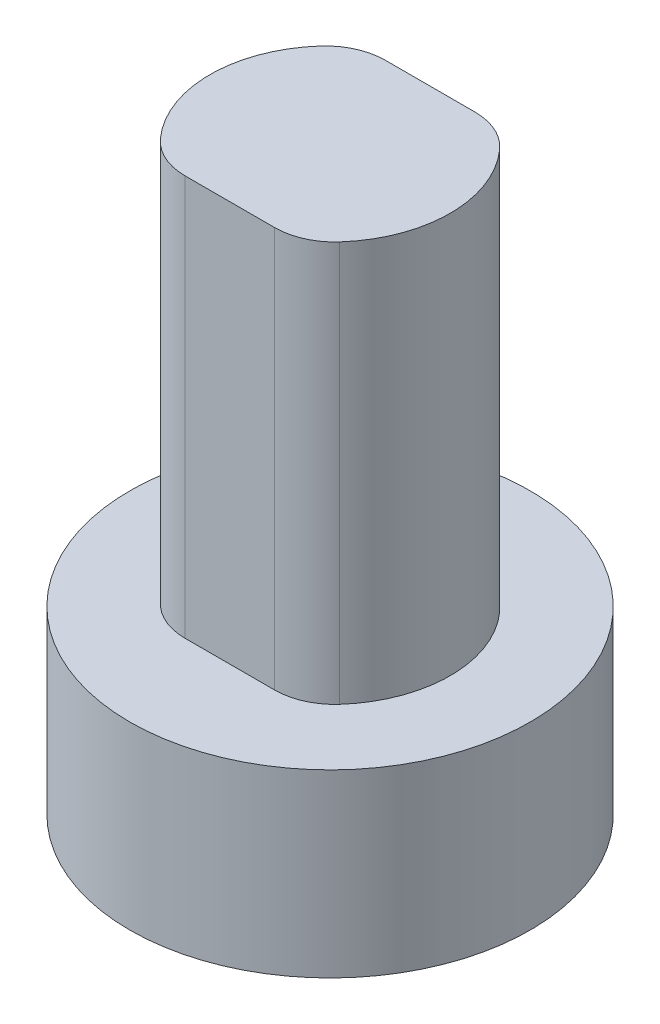
ISO-10303-21;
HEADER;
FILE_DESCRIPTION(('STEP AP214'),'2;1');
FILE_NAME('part.step','',(''),(''),'','','');
FILE_SCHEMA(('AUTOMOTIVE_DESIGN { 1 0 10303 214 1 1 1 1 }'));
ENDSEC;
DATA;
#1=APPLICATION_CONTEXT('core data for automotive mechanical design processes');
#2=APPLICATION_PROTOCOL_DEFINITION('international standard','automotive_design',2000,#1);
#3=PRODUCT_CONTEXT('',#1,'mechanical');
#4=PRODUCT('Part','Part','',(#3));
#5=PRODUCT_RELATED_PRODUCT_CATEGORY('part','',(#4));
#6=PRODUCT_DEFINITION_FORMATION('','',#4);
#7=PRODUCT_DEFINITION_CONTEXT('part definition',#1,'design');
#8=PRODUCT_DEFINITION('design','',#6,#7);
#9=PRODUCT_DEFINITION_SHAPE('','',#8);
#10=(LENGTH_UNIT() NAMED_UNIT(*) SI_UNIT(.MILLI.,.METRE.));
#11=(NAMED_UNIT(*) PLANE_ANGLE_UNIT() SI_UNIT($,.RADIAN.));
#12=(NAMED_UNIT(*) SI_UNIT($,.STERADIAN.) SOLID_ANGLE_UNIT());
#13=UNCERTAINTY_MEASURE_WITH_UNIT(LENGTH_MEASURE(1.E-05),#10,'distance_accuracy_value','');
#14=(GEOMETRIC_REPRESENTATION_CONTEXT(3) GLOBAL_UNCERTAINTY_ASSIGNED_CONTEXT((#13)) GLOBAL_UNIT_ASSIGNED_CONTEXT((#10,
#11,#12)) REPRESENTATION_CONTEXT('',''));
#15=CARTESIAN_POINT('',(0.,0.,0.));
#16=DIRECTION('',(0.,0.,1.));
#17=DIRECTION('',(1.,0.,0.));
#18=AXIS2_PLACEMENT_3D('',#15,#16,#17);
#19=CARTESIAN_POINT('',(0.,9.,0.));
#20=DIRECTION('',(0.,1.,0.));
#21=DIRECTION('',(0.,0.,1.));
#22=AXIS2_PLACEMENT_3D('',#19,#20,#21);
#23=PLANE('',#22);
#24=CARTESIAN_POINT('',(0.,9.,0.));
#25=DIRECTION('',(0.,1.,0.));
#26=DIRECTION('',(0.,0.,1.));
#27=AXIS2_PLACEMENT_3D('',#24,#25,#26);
#28=CIRCLE('',#27,10.);
#29=CARTESIAN_POINT('',(0.,9.,10.));
#30=VERTEX_POINT('',#29);
#31=EDGE_CURVE('E142',#30,#30,#28,.T.);
#32=ORIENTED_EDGE('',*,*,#31,.T.);
#33=EDGE_LOOP('',(#32));
#34=FACE_BOUND('',#33,.T.);
#35=DIRECTION('',(-1.,0.,0.));
#36=VECTOR('',#35,1.);
#37=CARTESIAN_POINT('',(-3.3166247903554,9.,-5.));
#38=LINE('',#37,#36);
#39=CARTESIAN_POINT('',(2.23606797749979,9.,-5.));
#40=VERTEX_POINT('',#39);
#41=CARTESIAN_POINT('',(-2.23606797749979,9.,-5.));
#42=VERTEX_POINT('',#41);
#43=EDGE_CURVE('E138',#40,#42,#38,.T.);
#44=ORIENTED_EDGE('',*,*,#43,.F.);
#45=CARTESIAN_POINT('',(2.23606797749979,9.,-2.));
#46=DIRECTION('',(0.,1.,0.));
#47=DIRECTION('',(0.,0.,1.));
#48=AXIS2_PLACEMENT_3D('',#45,#46,#47);
#49=CIRCLE('',#48,3.);
#50=CARTESIAN_POINT('',(4.47213595499957,9.,-4.00000000000001));
#51=VERTEX_POINT('',#50);
#52=EDGE_CURVE('E53',#40,#51,#49,.F.);
#53=ORIENTED_EDGE('',*,*,#52,.T.);
#54=CARTESIAN_POINT('',(0.,9.,0.));
#55=DIRECTION('',(0.,1.,0.));
#56=DIRECTION('',(0.,0.,1.));
#57=AXIS2_PLACEMENT_3D('',#54,#55,#56);
#58=CIRCLE('',#57,6.);
#59=CARTESIAN_POINT('',(4.47213595499958,9.,4.));
#60=VERTEX_POINT('',#59);
#61=EDGE_CURVE('E172',#60,#51,#58,.T.);
#62=ORIENTED_EDGE('',*,*,#61,.F.);
#63=CARTESIAN_POINT('',(2.23606797749979,9.,2.));
#64=DIRECTION('',(0.,1.,0.));
#65=DIRECTION('',(0.,0.,1.));
#66=AXIS2_PLACEMENT_3D('',#63,#64,#65);
#67=CIRCLE('',#66,3.);
#68=CARTESIAN_POINT('',(2.23606797749979,9.,5.));
#69=VERTEX_POINT('',#68);
#70=EDGE_CURVE('E117',#60,#69,#67,.F.);
#71=ORIENTED_EDGE('',*,*,#70,.T.);
#72=DIRECTION('',(1.,0.,0.));
#73=VECTOR('',#72,1.);
#74=CARTESIAN_POINT('',(-3.3166247903554,9.,5.));
#75=LINE('',#74,#73);
#76=CARTESIAN_POINT('',(-2.23606797749979,9.,5.));
#77=VERTEX_POINT('',#76);
#78=EDGE_CURVE('E124',#77,#69,#75,.T.);
#79=ORIENTED_EDGE('',*,*,#78,.F.);
#80=CARTESIAN_POINT('',(-2.23606797749979,9.,2.));
#81=DIRECTION('',(0.,1.,0.));
#82=DIRECTION('',(0.,0.,1.));
#83=AXIS2_PLACEMENT_3D('',#80,#81,#82);
#84=CIRCLE('',#83,3.);
#85=CARTESIAN_POINT('',(-4.47213595499958,9.,4.));
#86=VERTEX_POINT('',#85);
#87=EDGE_CURVE('E109',#77,#86,#84,.F.);
#88=ORIENTED_EDGE('',*,*,#87,.T.);
#89=CARTESIAN_POINT('',(0.,9.,0.));
#90=DIRECTION('',(0.,1.,0.));
#91=DIRECTION('',(0.,0.,1.));
#92=AXIS2_PLACEMENT_3D('',#89,#90,#91);
#93=CIRCLE('',#92,6.);
#94=CARTESIAN_POINT('',(-4.47213595499957,9.,-4.00000000000001));
#95=VERTEX_POINT('',#94);
#96=EDGE_CURVE('E133',#95,#86,#93,.T.);
#97=ORIENTED_EDGE('',*,*,#96,.F.);
#98=CARTESIAN_POINT('',(-2.23606797749979,9.,-2.));
#99=DIRECTION('',(0.,1.,0.));
#100=DIRECTION('',(0.,0.,1.));
#101=AXIS2_PLACEMENT_3D('',#98,#99,#100);
#102=CIRCLE('',#101,3.);
#103=EDGE_CURVE('E11',#95,#42,#102,.F.);
#104=ORIENTED_EDGE('',*,*,#103,.T.);
#105=EDGE_LOOP('',(#44,#53,#62,#71,#79,#88,#97,#104));
#106=FACE_BOUND('',#105,.T.);
#107=ADVANCED_FACE('F45',(#34,#106),#23,.T.);
#108=CARTESIAN_POINT('',(0.,9.,0.));
#109=DIRECTION('',(0.,-1.,0.));
#110=DIRECTION('',(0.,0.,-1.));
#111=AXIS2_PLACEMENT_3D('',#108,#109,#110);
#112=CYLINDRICAL_SURFACE('',#111,2.5);
#113=CARTESIAN_POINT('',(-2.16506350946109,6.14999999999999,1.25000000000001));
#114=CARTESIAN_POINT('',(-2.12353371517672,6.14999873137195,1.3219291847085));
#115=CARTESIAN_POINT('',(-2.07838353856231,6.14369332813587,1.39178230689896));
#116=CARTESIAN_POINT('',(-1.98252906044504,6.11885588365077,1.52523481324669));
#117=CARTESIAN_POINT('',(-1.93182135503529,6.10031631385543,1.58883031894281));
#118=CARTESIAN_POINT('',(-1.82719487571682,6.0521372811301,1.70810720640514));
#119=CARTESIAN_POINT('',(-1.7732921630364,6.02254993559188,1.76382408001949));
#120=CARTESIAN_POINT('',(-1.66413150841165,5.95352693083464,1.8671700683029));
#121=CARTESIAN_POINT('',(-1.60887339039992,5.91408998597569,1.91479812579754));
#122=CARTESIAN_POINT('',(-1.49430434392287,5.82286952215448,2.00570217734696));
#123=CARTESIAN_POINT('',(-1.43504342084643,5.7703265682589,2.04827525956344));
#124=CARTESIAN_POINT('',(-1.31948459264167,5.65618952097825,2.12456255849976));
#125=CARTESIAN_POINT('',(-1.26319103586365,5.59458262017788,2.15826404850568));
#126=CARTESIAN_POINT('',(-1.14782648576583,5.45302539379476,2.22204190134463));
#127=CARTESIAN_POINT('',(-1.08966466721043,5.37171133088716,2.25075895869275));
#128=CARTESIAN_POINT('',(-0.985324425751728,5.19912083324243,2.29835306933146));
#129=CARTESIAN_POINT('',(-0.939125317038169,5.10786198860459,2.31724716620823));
#130=CARTESIAN_POINT('',(-0.87506202966476,4.94413560527635,2.34202820343998));
#131=CARTESIAN_POINT('',(-0.852876835844806,4.87369396916482,2.35008539572471));
#132=CARTESIAN_POINT('',(-0.819764442685393,4.7299018511051,2.36184320351124));
#133=CARTESIAN_POINT('',(-0.808818425708717,4.65655644550119,2.36555110247705));
#134=CARTESIAN_POINT('',(-0.799472395859463,4.50867667417278,2.3687282166684));
#135=CARTESIAN_POINT('',(-0.801120275506478,4.43413884652659,2.36818125120268));
#136=CARTESIAN_POINT('',(-0.81685963254045,4.28652353828438,2.36279549840869));
#137=CARTESIAN_POINT('',(-0.830961620580132,4.2134473445196,2.3579530859199));
#138=CARTESIAN_POINT('',(-0.869147858792972,4.07363241128316,2.34413467443028));
#139=CARTESIAN_POINT('',(-0.892807048520268,4.00675695986501,2.33533307155703));
#140=CARTESIAN_POINT('',(-0.94805958193697,3.87715045890062,2.31345279809392));
#141=CARTESIAN_POINT('',(-0.9796555297181,3.81442077815266,2.30037272328863));
#142=CARTESIAN_POINT('',(-1.05585942664841,3.68145090678,2.26654472138117));
#143=CARTESIAN_POINT('',(-1.1018063193584,3.61223771034802,2.24478369620753));
#144=CARTESIAN_POINT('',(-1.1996934802501,3.4810080681833,2.19403356813268));
#145=CARTESIAN_POINT('',(-1.25164106207361,3.41900059332767,2.1650355938273));
#146=CARTESIAN_POINT('',(-1.37038527658769,3.29079581751367,2.09232821751264));
#147=CARTESIAN_POINT('',(-1.43803055046626,3.22638563153817,2.04681640585641));
#148=CARTESIAN_POINT('',(-1.57502520860125,3.11069375916494,1.94335840592309));
#149=CARTESIAN_POINT('',(-1.64437285788471,3.05939926885102,1.88542444689645));
#150=CARTESIAN_POINT('',(-1.76754566756822,2.98076937013591,1.7695927317597));
#151=CARTESIAN_POINT('',(-1.82173613854355,2.95070429619159,1.71393872555412));
#152=CARTESIAN_POINT('',(-1.92670285921393,2.90174403146117,1.59501958596665));
#153=CARTESIAN_POINT('',(-1.97748193430502,2.88283949361835,1.53176087520176));
#154=CARTESIAN_POINT('',(-2.07378299189248,2.85714787455097,1.39864055976256));
#155=CARTESIAN_POINT('',(-2.11928291512752,2.85041003867469,1.32875332068215));
#156=CARTESIAN_POINT('',(-2.20304957242113,2.84962658503506,1.18469886054126));
#157=CARTESIAN_POINT('',(-2.24131654557407,2.85558054764825,1.11053178106218));
#158=CARTESIAN_POINT('',(-2.30735495563436,2.87899822975948,0.965429511763569));
#159=CARTESIAN_POINT('',(-2.33565135077131,2.89567875181353,0.89460282121381));
#160=CARTESIAN_POINT('',(-2.38492690346505,2.93896514344755,0.753469066587156));
#161=CARTESIAN_POINT('',(-2.40590488472329,2.96557260717726,0.68316208782018));
#162=CARTESIAN_POINT('',(-2.44208198308459,3.02968198695996,0.540375708300077));
#163=CARTESIAN_POINT('',(-2.45682232989855,3.06777480993121,0.468047674045507));
#164=CARTESIAN_POINT('',(-2.47945588980268,3.15282892231759,0.327664176624084));
#165=CARTESIAN_POINT('',(-2.48734456596091,3.19979606297082,0.259611572114069));
#166=CARTESIAN_POINT('',(-2.49831313882978,3.30961080419749,0.118966697421991));
#167=CARTESIAN_POINT('',(-2.50044214778393,3.37379416920505,0.0473425059456694));
#168=CARTESIAN_POINT('',(-2.49940737191238,3.51166557220157,-0.0861340157810891));
#169=CARTESIAN_POINT('',(-2.49624052729707,3.58535908217025,-0.147980674258409));
#170=CARTESIAN_POINT('',(-2.48759924740308,3.73370339941786,-0.253730174479015));
#171=CARTESIAN_POINT('',(-2.48238573672775,3.80752954809478,-0.298806064861464));
#172=CARTESIAN_POINT('',(-2.47181962548568,3.96149631904881,-0.376359995978659));
#173=CARTESIAN_POINT('',(-2.46646729481618,4.04162522591712,-0.408860774928506));
#174=CARTESIAN_POINT('',(-2.458463059148,4.19279856186902,-0.454317463685759));
#175=CARTESIAN_POINT('',(-2.45550858260709,4.26310833243817,-0.469639267361441));
#176=CARTESIAN_POINT('',(-2.45186527643105,4.40533882936877,-0.488317826621825));
#177=CARTESIAN_POINT('',(-2.451174274332,4.47725794428713,-0.491686055407366));
#178=CARTESIAN_POINT('',(-2.4522792092657,4.62059113363753,-0.486140071273256));
#179=CARTESIAN_POINT('',(-2.45407523286097,4.69200519040373,-0.477225430840491));
#180=CARTESIAN_POINT('',(-2.4595816109339,4.83240243452481,-0.447964495940912));
#181=CARTESIAN_POINT('',(-2.46329449129378,4.90138228582659,-0.427603114708746));
#182=CARTESIAN_POINT('',(-2.4726930384924,5.05417079765174,-0.369939603805397));
#183=CARTESIAN_POINT('',(-2.47864019968723,5.13677236327342,-0.329501921910887));
#184=CARTESIAN_POINT('',(-2.48930405138671,5.29439420967663,-0.235767839599172));
#185=CARTESIAN_POINT('',(-2.49401901423392,5.36940375646762,-0.182453584280551));
#186=CARTESIAN_POINT('',(-2.4998733665278,5.51234437962016,-0.0646090414340575));
#187=CARTESIAN_POINT('',(-2.50094991833122,5.58013166298806,9.82460343240698E-05));
#188=CARTESIAN_POINT('',(-2.49714395791772,5.70635347060614,0.13795104258422));
#189=CARTESIAN_POINT('',(-2.49225973511684,5.7647853046465,0.211098968449296));
#190=CARTESIAN_POINT('',(-2.47345085882748,5.87783171013876,0.373547148239939));
#191=CARTESIAN_POINT('',(-2.45846469435129,5.93103774089958,0.463721311107341));
#192=CARTESIAN_POINT('',(-2.41615428277923,6.02162979943429,0.648973623372373));
#193=CARTESIAN_POINT('',(-2.38885323449735,6.05904531806631,0.744042255606794));
#194=CARTESIAN_POINT('',(-2.33013740413686,6.10788092445761,0.908795010939024));
#195=CARTESIAN_POINT('',(-2.3018673516035,6.12360538601067,0.97834189143777));
#196=CARTESIAN_POINT('',(-2.23843905308094,6.14466271697479,1.11584476801706));
#197=CARTESIAN_POINT('',(-2.20328451781612,6.15000116755316,1.18380159913897));
#198=CARTESIAN_POINT('',(-2.16506350946109,6.14999999999999,1.25000000000001));
#199=B_SPLINE_CURVE_WITH_KNOTS('',3,(#113,#114,#115,#116,#117,#118,#119,#120,#121,#122,#123,
#124,#125,#126,#127,#128,#129,#130,#131,#132,#133,#134,#135,#136,#137,#138,#139,#140,#141,#142,
#143,#144,#145,#146,#147,#148,#149,#150,#151,#152,#153,#154,#155,#156,#157,#158,#159,#160,#161,
#162,#163,#164,#165,#166,#167,#168,#169,#170,#171,#172,#173,#174,#175,#176,#177,#178,#179,#180,
#181,#182,#183,#184,#185,#186,#187,#188,#189,#190,#191,#192,#193,#194,#195,#196,#197,#198),
.UNSPECIFIED.,.T.,.F.,(4,2,2,2,2,2,2,2,2,2,2,2,2,2,2,2,2,2,2,2,2,2,2,2,2,2,2,2,2,2,2,2,2,2,2,2,
2,2,2,2,2,2,4),(0.,0.248863173219163,0.497879632505736,0.745735911637781,0.993624559661679,
1.26236142699034,1.53148173454875,1.84208059721147,2.15213873331274,2.37412103166173,
2.59573105830193,2.81818424963006,3.04082536007009,3.25449658913792,3.46823801663209,
3.72496879793679,3.98201585158999,4.29224112966058,4.6021623906296,4.85099486407879,
5.09961864119513,5.34924649914313,5.59886610388088,5.83205917661707,6.06528971354038,
6.31352952087292,6.56193357870848,6.84938688817396,7.13700633715914,7.39601090345957,
7.65454492637286,7.86965548867983,8.08455952907282,8.29947104952724,8.51466648895037,
8.78967221613732,9.06506148314459,9.34518323893303,9.62538540113003,9.94089155188797,
10.2558058174588,10.484964597082,10.7140001987933),.UNSPECIFIED.);
#200=CARTESIAN_POINT('',(-2.16506350946109,6.14999999999999,1.25000000000001));
#201=VERTEX_POINT('',#200);
#202=EDGE_CURVE('E367',#201,#201,#199,.T.);
#203=ORIENTED_EDGE('',*,*,#202,.F.);
#204=EDGE_LOOP('',(#203));
#205=FACE_BOUND('',#204,.T.);
#206=CARTESIAN_POINT('',(0.,6.14999999999999,-2.5));
#207=CARTESIAN_POINT('',(-0.0830573983732399,6.14999873137195,-2.49999873549003));
#208=CARTESIAN_POINT('',(-0.166127065031047,6.14369332813587,-2.49582409665183));
#209=CARTESIAN_POINT('',(-0.329627564785519,6.11885588365077,-2.47953793670965));
#210=CARTESIAN_POINT('',(-0.410056740989749,6.10031631385543,-2.46742152850525));
#211=CARTESIAN_POINT('',(-0.565666795275703,6.0521372811301,-2.43645078323809));
#212=CARTESIAN_POINT('',(-0.640870379585382,6.02254993559188,-2.41762810153113));
#213=CARTESIAN_POINT('',(-0.784950958130404,5.95352693083464,-2.37476519567406));
#214=CARTESIAN_POINT('',(-0.853827124859528,5.91408998597569,-2.3507242904579));
#215=CARTESIAN_POINT('',(-0.989836866046779,5.82286952215448,-2.29695661149613));
#216=CARTESIAN_POINT('',(-1.05633669830188,5.7703265682589,-2.26692168776846));
#217=CARTESIAN_POINT('',(-1.18018285126921,5.65618952097825,-2.20498845637974));
#218=CARTESIAN_POINT('',(-1.23751597614873,5.59458262017788,-2.17308755114355));
#219=CARTESIAN_POINT('',(-1.35043149195499,5.45302539379476,-2.10506784648215));
#220=CARTESIAN_POINT('',(-1.40438210241811,5.37171133088716,-2.06905676275693));
#221=CARTESIAN_POINT('',(-1.49776993203111,5.19912083324243,-2.00249251833605));
#222=CARTESIAN_POINT('',(-1.53723225426473,5.10786198860459,-1.97192996499629));
#223=CARTESIAN_POINT('',(-1.59072490572626,4.94413560527635,-1.92884004929685));
#224=CARTESIAN_POINT('',(-1.60879523583799,4.87369396916482,-1.91365570400325));
#225=CARTESIAN_POINT('',(-1.63553399265365,4.7299018511051,-1.89085843424037));
#226=CARTESIAN_POINT('',(-1.64421813584104,4.65655644550119,-1.88323285495122));
#227=CARTESIAN_POINT('',(-1.6516426123661,4.50867667417278,-1.87672751277291));
#228=CARTESIAN_POINT('',(-1.65034498655429,4.43413884652659,-1.87788113567675));
#229=CARTESIAN_POINT('',(-1.6378111092992,4.28652353828438,-1.8888189423104));
#230=CARTESIAN_POINT('',(-1.62656646304847,4.2134473445196,-1.89861041595224));
#231=CARTESIAN_POINT('',(-1.59550624855209,4.07363241128316,-1.92477146257471));
#232=CARTESIAN_POINT('',(-1.57605424200619,4.00675695986501,-1.94086012047488));
#233=CARTESIAN_POINT('',(-1.52947910263703,3.87715045890062,-1.97777008130564));
#234=CARTESIAN_POINT('',(-1.50235345168169,3.81442077815266,-1.9985929373381));
#235=CARTESIAN_POINT('',(-1.4349555942054,3.68145090678,-2.04767344699339));
#236=CARTESIAN_POINT('',(-1.39313654723764,3.61223771034802,-2.07658411071837));
#237=CARTESIAN_POINT('',(-1.30024206663366,3.4810080681833,-2.13598181471749));
#238=CARTESIAN_POINT('',(-1.24915529331516,3.41900059332767,-2.16647075308914));
#239=CARTESIAN_POINT('',(-1.1268167511271,3.29079581751367,-2.23295257125343));
#240=CARTESIAN_POINT('',(-1.05357972912127,3.22638563153817,-2.26877919105011));
#241=CARTESIAN_POINT('',(-0.895485143886795,3.11069375916494,-2.33569104521112));
#242=CARTESIAN_POINT('',(-0.810639038986183,3.05939926885102,-2.36678089167001));
#243=CARTESIAN_POINT('',(-0.648739426272076,2.98076937013591,-2.41553581634306));
#244=CARTESIAN_POINT('',(-0.573446407588012,2.95070429619159,-2.43463913774794));
#245=CARTESIAN_POINT('',(-0.417976051373877,2.90174403146117,-2.4660834146067));
#246=CARTESIAN_POINT('',(-0.337802863295286,2.88283949361835,-2.47843002823382));
#247=CARTESIAN_POINT('',(-0.174366759571415,2.85714787455097,-2.49526903279627));
#248=CARTESIAN_POINT('',(-0.0910926735098981,2.85041003867469,-2.49972950264785));
#249=CARTESIAN_POINT('',(0.0755454771473721,2.84962658503506,-2.50024632578377));
#250=CARTESIAN_POINT('',(0.158909538677223,2.85558054764825,-2.49630295692062));
#251=CARTESIAN_POINT('',(0.317590995066731,2.87899822975948,-2.48094276300905));
#252=CARTESIAN_POINT('',(0.393076905917279,2.89567875181353,-2.4700348147583));
#253=CARTESIAN_POINT('',(0.539940099102309,2.93896514344755,-2.44214181786326));
#254=CARTESIAN_POINT('',(0.611316719406965,2.96557260717726,-2.42515579316953));
#255=CARTESIAN_POINT('',(0.753061900566429,3.02968198695996,-2.38509288962557));
#256=CARTESIAN_POINT('',(0.823069989043659,3.06777480993122,-2.36169438729977));
#257=CARTESIAN_POINT('',(0.955962444034783,3.1528289223176,-2.31110387644411));
#258=CARTESIAN_POINT('',(1.01884206641326,3.19979606297082,-2.28390936814435));
#259=CARTESIAN_POINT('',(1.14612838724312,3.30961080419749,-2.22308599354602));
#260=CARTESIAN_POINT('',(1.20922126106421,3.37379416920505,-2.18911767364703));
#261=CARTESIAN_POINT('',(1.32429793175259,3.51166557220158,-2.12148327059167));
#262=CARTESIAN_POINT('',(1.37627528682548,3.58535908217025,-2.08781737346631));
#263=CARTESIAN_POINT('',(1.46353640050703,3.73370339941786,-2.0274590554466));
#264=CARTESIAN_POINT('',(1.49996651133877,3.80752954809478,-2.00040607756764));
#265=CARTESIAN_POINT('',(1.56184713022858,3.96149631904881,-1.95247859125419));
#266=CARTESIAN_POINT('',(1.58731746510718,4.04162522591712,-1.93159294745003));
#267=CARTESIAN_POINT('',(1.62268199450879,4.19279856186902,-1.90193273164489));
#268=CARTESIAN_POINT('',(1.63447382745327,4.26310833243818,-1.89171317806774));
#269=CARTESIAN_POINT('',(1.64882828119084,4.40533882936877,-1.87921870273532));
#270=CARTESIAN_POINT('',(1.65139975183535,4.47725794428713,-1.87693616297071));
#271=CARTESIAN_POINT('',(1.64714925615307,4.62059113363753,-1.88066605675987));
#272=CARTESIAN_POINT('',(1.64032696287033,4.69200519040373,-1.88667877903556));
#273=CARTESIAN_POINT('',(1.61773943894528,4.83240243452481,-1.90607790977935));
#274=CARTESIAN_POINT('',(1.60196240572202,4.90138228582659,-1.9194740491083));
#275=CARTESIAN_POINT('',(1.55672361400763,5.05417079765174,-1.95644518519265));
#276=CARTESIAN_POINT('',(1.52467713481425,5.13677236327342,-1.98181441881502));
#277=CARTESIAN_POINT('',(1.44883296418162,5.29439420967663,-2.03791662644482));
#278=CARTESIAN_POINT('',(1.40501894611545,5.36940375646762,-2.06865703170772));
#279=CARTESIAN_POINT('',(1.30588975445996,5.51234437962016,-2.13264932094016));
#280=CARTESIAN_POINT('',(1.25038987560407,5.58013166298806,-2.16593528588461));
#281=CARTESIAN_POINT('',(1.12910287160239,5.70635347060613,-2.23156562575567));
#282=CARTESIAN_POINT('',(1.06331279816865,5.7647853046465,-2.2639097276649));
#283=CARTESIAN_POINT('',(0.913224109526733,5.87783171013876,-2.328844852877));
#284=CARTESIAN_POINT('',(0.827637911480471,5.93103774089958,-2.36095353516903));
#285=CARTESIAN_POINT('',(0.646049497163118,6.02162979943429,-2.41693780003557));
#286=CARTESIAN_POINT('',(0.55006712240413,6.05904531806631,-2.44082871479073));
#287=CARTESIAN_POINT('',(0.378029135762689,6.10788092445761,-2.47235569176036));
#288=CARTESIAN_POINT('',(0.303664744230136,6.12360538601067,-2.48264654834952));
#289=CARTESIAN_POINT('',(0.152869610757757,6.14466271697479,-2.49646746879981));
#290=CARTESIAN_POINT('',(0.0764400010130767,6.15000116755316,-2.50000116376319));
#291=CARTESIAN_POINT('',(0.,6.14999999999999,-2.5));
#292=B_SPLINE_CURVE_WITH_KNOTS('',3,(#206,#207,#208,#209,#210,#211,#212,#213,#214,#215,#216,
#217,#218,#219,#220,#221,#222,#223,#224,#225,#226,#227,#228,#229,#230,#231,#232,#233,#234,#235,
#236,#237,#238,#239,#240,#241,#242,#243,#244,#245,#246,#247,#248,#249,#250,#251,#252,#253,#254,
#255,#256,#257,#258,#259,#260,#261,#262,#263,#264,#265,#266,#267,#268,#269,#270,#271,#272,#273,
#274,#275,#276,#277,#278,#279,#280,#281,#282,#283,#284,#285,#286,#287,#288,#289,#290,#291),
.UNSPECIFIED.,.T.,.F.,(4,2,2,2,2,2,2,2,2,2,2,2,2,2,2,2,2,2,2,2,2,2,2,2,2,2,2,2,2,2,2,2,2,2,2,2,
2,2,2,2,2,2,4),(0.,0.248863173219163,0.497879632505736,0.745735911637781,0.993624559661678,
1.26236142699034,1.53148173454875,1.84208059721147,2.15213873331274,2.37412103166173,
2.59573105830193,2.81818424963006,3.04082536007009,3.25449658913792,3.46823801663209,
3.72496879793679,3.98201585158999,4.29224112966058,4.6021623906296,4.85099486407879,
5.09961864119513,5.34924649914313,5.59886610388088,5.83205917661707,6.06528971354038,
6.31352952087292,6.56193357870848,6.84938688817396,7.13700633715914,7.39601090345957,
7.65454492637286,7.86965548867983,8.08455952907282,8.29947104952725,8.51466648895037,
8.78967221613732,9.06506148314459,9.34518323893303,9.62538540113004,9.94089155188797,
10.2558058174588,10.484964597082,10.7140001987933),.UNSPECIFIED.);
#293=CARTESIAN_POINT('',(0.,6.14999999999999,-2.5));
#294=VERTEX_POINT('',#293);
#295=EDGE_CURVE('E236',#294,#294,#292,.T.);
#296=ORIENTED_EDGE('',*,*,#295,.F.);
#297=EDGE_LOOP('',(#296));
#298=FACE_BOUND('',#297,.T.);
#299=CARTESIAN_POINT('',(0.,0.,0.));
#300=DIRECTION('',(0.,1.,0.));
#301=DIRECTION('',(0.,0.,1.));
#302=AXIS2_PLACEMENT_3D('',#299,#300,#301);
#303=CIRCLE('',#302,2.5);
#304=CARTESIAN_POINT('',(0.,0.,2.5));
#305=VERTEX_POINT('',#304);
#306=EDGE_CURVE('E146',#305,#305,#303,.T.);
#307=ORIENTED_EDGE('',*,*,#306,.F.);
#308=EDGE_LOOP('',(#307));
#309=FACE_BOUND('',#308,.T.);
#310=CARTESIAN_POINT('',(0.,22.,0.));
#311=DIRECTION('',(0.,-1.,0.));
#312=DIRECTION('',(0.,0.,-1.));
#313=AXIS2_PLACEMENT_3D('',#310,#311,#312);
#314=CIRCLE('',#313,2.5);
#315=CARTESIAN_POINT('',(0.,22.,-2.5));
#316=VERTEX_POINT('',#315);
#317=EDGE_CURVE('E177',#316,#316,#314,.T.);
#318=ORIENTED_EDGE('',*,*,#317,.F.);
#319=EDGE_LOOP('',(#318));
#320=FACE_BOUND('',#319,.T.);
#321=ADVANCED_FACE('F209',(#205,#298,#309,#320),#112,.F.);
#322=CARTESIAN_POINT('',(0.,9.,0.));
#323=DIRECTION('',(0.,-1.,0.));
#324=DIRECTION('',(0.,0.,-1.));
#325=AXIS2_PLACEMENT_3D('',#322,#323,#324);
#326=CYLINDRICAL_SURFACE('',#325,10.);
#327=CARTESIAN_POINT('',(-8.66025403784437,6.14999999999999,5.00000000000004));
#328=CARTESIAN_POINT('',(-8.61424695386681,6.14999629901469,5.07968347211924));
#329=CARTESIAN_POINT('',(-8.56710606814318,6.14227754131458,5.1587707114546));
#330=CARTESIAN_POINT('',(-8.47201395303659,6.11161876486206,5.31349690083578));
#331=CARTESIAN_POINT('',(-8.42406201394487,6.08866466304119,5.38913259117967));
#332=CARTESIAN_POINT('',(-8.32903466381875,6.02824636106408,5.53486629689461));
#333=CARTESIAN_POINT('',(-8.28195857385746,5.99079393643969,5.6049687508722));
#334=CARTESIAN_POINT('',(-8.19035610806164,5.90247274585137,5.7379959858219));
#335=CARTESIAN_POINT('',(-8.14582943486076,5.85160554849499,5.80092160475954));
#336=CARTESIAN_POINT('',(-8.06066709842184,5.73739122286708,5.91869744297817));
#337=CARTESIAN_POINT('',(-8.02006722794648,5.67394293638174,5.9734754548659));
#338=CARTESIAN_POINT('',(-7.94485974114897,5.53658522640677,6.07314676378825));
#339=CARTESIAN_POINT('',(-7.91025249949389,5.46267514935681,6.11803944282642));
#340=CARTESIAN_POINT('',(-7.8483619498806,5.30594065632332,6.19723850124928));
#341=CARTESIAN_POINT('',(-7.82112403335192,5.22306520565612,6.23147945637892));
#342=CARTESIAN_POINT('',(-7.77553550878447,5.05109737476351,6.28827338214783));
#343=CARTESIAN_POINT('',(-7.75718431268401,4.96200540635072,6.31082712617282));
#344=CARTESIAN_POINT('',(-7.73039975184367,4.78098541799901,6.34360845183638));
#345=CARTESIAN_POINT('',(-7.7218783856889,4.68909024432124,6.35394542478533));
#346=CARTESIAN_POINT('',(-7.7148863910566,4.50436263407657,6.36243351148473));
#347=CARTESIAN_POINT('',(-7.71641506540515,4.41153026296937,6.36058547051272));
#348=CARTESIAN_POINT('',(-7.72937692560644,4.22855272294329,6.34482715005175));
#349=CARTESIAN_POINT('',(-7.74070995493516,4.13838988597263,6.33103884508822));
#350=CARTESIAN_POINT('',(-7.77258858284567,3.96231592946661,6.29185973216237));
#351=CARTESIAN_POINT('',(-7.79313449165143,3.87640495321172,6.26646853349691));
#352=CARTESIAN_POINT('',(-7.84258683961042,3.71080647007558,6.20446641181719));
#353=CARTESIAN_POINT('',(-7.87153223493753,3.63115021075932,6.16780316164587));
#354=CARTESIAN_POINT('',(-7.93644263196013,3.48066567609225,6.08405100871078));
#355=CARTESIAN_POINT('',(-7.97240818916525,3.40983810008771,6.03696128085391));
#356=CARTESIAN_POINT('',(-8.05030562006915,3.27812002111733,5.93269379206283));
#357=CARTESIAN_POINT('',(-8.0923046297711,3.21736060537005,5.8754004927947));
#358=CARTESIAN_POINT('',(-8.18021275810458,3.10853397839374,5.75237564300237));
#359=CARTESIAN_POINT('',(-8.22612190100619,3.06046684595291,5.6866440401006));
#360=CARTESIAN_POINT('',(-8.32011333395339,2.97837784946569,5.54821686425202));
#361=CARTESIAN_POINT('',(-8.36819735691171,2.94436741236198,5.47551568451769));
#362=CARTESIAN_POINT('',(-8.46474631441262,2.89147808722467,5.3250401975006));
#363=CARTESIAN_POINT('',(-8.51321121740284,2.87259795885522,5.24726630662834));
#364=CARTESIAN_POINT('',(-8.60833497911074,2.85068253883883,5.08968957967395));
#365=CARTESIAN_POINT('',(-8.65500820971007,2.84746726387847,5.00992042763085));
#366=CARTESIAN_POINT('',(-8.74574789381547,2.85649319868027,4.84977972124075));
#367=CARTESIAN_POINT('',(-8.78981444549316,2.86873382596048,4.7694081897089));
#368=CARTESIAN_POINT('',(-8.87397530500753,2.9081744027771,4.6109186630234));
#369=CARTESIAN_POINT('',(-8.91409157726081,2.93528539430836,4.53279014626832));
#370=CARTESIAN_POINT('',(-8.98984372557428,3.00360239255508,4.38063235433321));
#371=CARTESIAN_POINT('',(-9.02547935405787,3.04480917766169,4.3066033057944));
#372=CARTESIAN_POINT('',(-9.09202712145392,3.14056131949899,4.16428565038655));
#373=CARTESIAN_POINT('',(-9.12289560289641,3.1952192859171,4.0960524121839));
#374=CARTESIAN_POINT('',(-9.17922882761276,3.31616714906879,3.96820461092356));
#375=CARTESIAN_POINT('',(-9.20469318638615,3.3824578728543,3.9085906612198));
#376=CARTESIAN_POINT('',(-9.25031265179175,3.5255961063283,3.79937664923304));
#377=CARTESIAN_POINT('',(-9.2704112883987,3.60254387109881,3.74988428802291));
#378=CARTESIAN_POINT('',(-9.30492355939143,3.76434104706747,3.66341020907198));
#379=CARTESIAN_POINT('',(-9.31933737136509,3.84919021133191,3.62642810052931));
#380=CARTESIAN_POINT('',(-9.3424530943708,4.02403953240315,3.56645564462377));
#381=CARTESIAN_POINT('',(-9.35117822401892,4.11401709979667,3.5434084496404));
#382=CARTESIAN_POINT('',(-9.36303806471151,4.29685131178056,3.51195183314056));
#383=CARTESIAN_POINT('',(-9.36617325117034,4.38970771084816,3.50354116681578));
#384=CARTESIAN_POINT('',(-9.36686338370776,4.57445064130181,3.50169533620379));
#385=CARTESIAN_POINT('',(-9.36448604444843,4.66633516019211,3.50807844790536));
#386=CARTESIAN_POINT('',(-9.35428138890246,4.84764775186387,3.53519818966865));
#387=CARTESIAN_POINT('',(-9.34645408927591,4.93707583215359,3.55593477585291));
#388=CARTESIAN_POINT('',(-9.32533549537295,5.11086524243541,3.61095253477269));
#389=CARTESIAN_POINT('',(-9.31205029955106,5.19523210745096,3.64521858851578));
#390=CARTESIAN_POINT('',(-9.2799939798782,5.35670626686032,3.72606959755306));
#391=CARTESIAN_POINT('',(-9.26122259282943,5.43381321272772,3.77265514385972));
#392=CARTESIAN_POINT('',(-9.21795981973421,5.57954549763769,3.87716953281877));
#393=CARTESIAN_POINT('',(-9.19340444570303,5.64806175981956,3.93522400350808));
#394=CARTESIAN_POINT('',(-9.1388012966813,5.77369059987675,4.06041434589588));
#395=CARTESIAN_POINT('',(-9.10875225470475,5.83080054078023,4.12755231155955));
#396=CARTESIAN_POINT('',(-9.04322158787421,5.93234742257348,4.26922360669501));
#397=CARTESIAN_POINT('',(-9.00770463577451,5.97669614797802,4.34380383000343));
#398=CARTESIAN_POINT('',(-8.93192368833484,6.0508633528063,4.49756120342767));
#399=CARTESIAN_POINT('',(-8.8916644909017,6.08069636412524,4.57673366691874));
#400=CARTESIAN_POINT('',(-8.81962327438732,6.11847934152684,4.71363641426027));
#401=CARTESIAN_POINT('',(-8.78881655486917,6.13028074881449,4.77084759023067));
#402=CARTESIAN_POINT('',(-8.72561868388335,6.1460423389331,4.8854746013535));
#403=CARTESIAN_POINT('',(-8.69322755884517,6.15000265251578,4.94289043307725));
#404=CARTESIAN_POINT('',(-8.66025403784437,6.14999999999999,5.00000000000004));
#405=B_SPLINE_CURVE_WITH_KNOTS('',3,(#327,#328,#329,#330,#331,#332,#333,#334,#335,#336,#337,
#338,#339,#340,#341,#342,#343,#344,#345,#346,#347,#348,#349,#350,#351,#352,#353,#354,#355,#356,
#357,#358,#359,#360,#361,#362,#363,#364,#365,#366,#367,#368,#369,#370,#371,#372,#373,#374,#375,
#376,#377,#378,#379,#380,#381,#382,#383,#384,#385,#386,#387,#388,#389,#390,#391,#392,#393,#394,
#395,#396,#397,#398,#399,#400,#401,#402,#403,#404),.UNSPECIFIED.,.T.,.F.,(4,2,2,2,2,2,2,2,2,2,2,
2,2,2,2,2,2,2,2,2,2,2,2,2,2,2,2,2,2,2,2,2,2,2,2,2,2,2,4),(0.,0.275793319008917,
0.551841928312972,0.827666799870597,1.1034594331417,1.38156673144315,1.65969141110741,
1.93949209608633,2.21927426326044,2.49653175525206,2.77377001402269,3.04820914252876,
3.32265751287871,3.59839967320042,3.87416366201706,4.1532757240192,4.43238951858747,
4.71172976565332,4.991047110928,5.26714751096616,5.54323750600189,5.81769359979004,
6.09216485190803,6.36901711215385,6.64588906369257,6.92556925596458,7.20524071063227,
7.48376340648032,7.76226241335696,8.03735855216244,8.31245385002402,8.58724259883658,
8.86204453269316,9.14004258759616,9.41810483731131,9.69804546871317,9.97770526783281,
10.1753710978727,10.3730336317698),.UNSPECIFIED.);
#406=CARTESIAN_POINT('',(-8.66025403784437,6.14999999999999,5.00000000000004));
#407=VERTEX_POINT('',#406);
#408=EDGE_CURVE('E371',#407,#407,#405,.T.);
#409=ORIENTED_EDGE('',*,*,#408,.T.);
#410=EDGE_LOOP('',(#409));
#411=FACE_BOUND('',#410,.T.);
#412=CARTESIAN_POINT('',(0.,6.14999999999999,-10.));
#413=CARTESIAN_POINT('',(-0.0920114531057511,6.14999629901469,-9.99999843258099));
#414=CARTESIAN_POINT('',(-0.184073454347172,6.14227754131458,-9.99871684765511));
#415=CARTESIAN_POINT('',(-0.365616322535328,6.11161876486206,-9.99372775496381));
#416=CARTESIAN_POINT('',(-0.455094721351767,6.08866466304119,-9.99001800272159));
#417=CARTESIAN_POINT('',(-0.628817487751613,6.02824636106408,-9.98058875631552));
#418=CARTESIAN_POINT('',(-0.713066038744483,5.99079393643969,-9.974870893487));
#419=CARTESIAN_POINT('',(-0.874072236504039,5.90247274585137,-9.96205444853338));
#420=CARTESIAN_POINT('',(-0.950830757653325,5.85160554849499,-9.95495602786423));
#421=CARTESIAN_POINT('',(-1.09540879372212,5.73739122286708,-9.9400912001718));
#422=CARTESIAN_POINT('',(-1.16314787882339,5.67394293638174,-9.93231968689365));
#423=CARTESIAN_POINT('',(-1.28706950777735,5.53658522640677,-9.9170237472334));
#424=CARTESIAN_POINT('',(-1.34325132909588,5.46267514935681,-9.90949933632427));
#425=CARTESIAN_POINT('',(-1.44278500045253,5.30594065632332,-9.89550007731641));
#426=CARTESIAN_POINT('',(-1.48605749570898,5.22306520565612,-9.88903182722124));
#427=CARTESIAN_POINT('',(-1.55803674048924,5.05109737476351,-9.87794796970923));
#428=CARTESIAN_POINT('',(-1.58674445381555,4.96200540635072,-9.8733322397089));
#429=CARTESIAN_POINT('',(-1.62852619503009,4.78098541799901,-9.86652679242373));
#430=CARTESIAN_POINT('',(-1.64173895927951,4.68909024432124,-9.86431555933323));
#431=CARTESIAN_POINT('',(-1.65258585530686,4.50436263407657,-9.86250435770823));
#432=CARTESIAN_POINT('',(-1.65022106770359,4.41153026296937,-9.86290420804218));
#433=CARTESIAN_POINT('',(-1.63009303176277,4.22855272294329,-9.86625034802632));
#434=CARTESIAN_POINT('',(-1.61248549472487,4.13838988597263,-9.86917088684506));
#435=CARTESIAN_POINT('',(-1.56261607367809,3.9623159294666,-9.87718903199043));
#436=CARTESIAN_POINT('',(-1.53035369619838,3.87640495321172,-9.88228671162733));
#437=CARTESIAN_POINT('',(-1.45193210975571,3.71080647007558,-9.89411264039674));
#438=CARTESIAN_POINT('',(-1.4057081060585,3.63115021075932,-9.90084846298694));
#439=CARTESIAN_POINT('',(-1.30072141548377,3.48066567609225,-9.9151864393107));
#440=CARTESIAN_POINT('',(-1.24195773629986,3.40983810008771,-9.92278866158316));
#441=CARTESIAN_POINT('',(-1.11271072676602,3.27812002111733,-9.93811607123993));
#442=CARTESIAN_POINT('',(-1.04209376928222,3.21736060537005,-9.94584163094155));
#443=CARTESIAN_POINT('',(-0.891597059898563,3.10853397839374,-9.96045987838133));
#444=CARTESIAN_POINT('',(-0.811717250503355,3.06046684595291,-9.9673525609492));
#445=CARTESIAN_POINT('',(-0.644840083170752,2.97837784946569,-9.97953794169528));
#446=CARTESIAN_POINT('',(-0.557837003156558,2.94436741236198,-9.98482933722619));
#447=CARTESIAN_POINT('',(-0.37924693000247,2.89147808722467,-9.99320544362233));
#448=CARTESIAN_POINT('',(-0.287660313260821,2.87259795885522,-9.99629033536768));
#449=CARTESIAN_POINT('',(-0.103632983819161,2.85068253883883,-9.99988156603306));
#450=CARTESIAN_POINT('',(-0.0112142564118354,2.84746726387847,-10.0004171933872));
#451=CARTESIAN_POINT('',(0.172841505554681,2.85649319868027,-9.99892971175882));
#452=CARTESIAN_POINT('',(0.264478569441163,2.86873382596048,-9.99690669920295));
#453=CARTESIAN_POINT('',(0.443814955541768,2.9081744027771,-9.99054737820398));
#454=CARTESIAN_POINT('',(0.5315343719383,2.93528539430836,-9.98622483070291));
#455=CARTESIAN_POINT('',(0.70118295929459,3.00360239255508,-9.97574921956607));
#456=CARTESIAN_POINT('',(0.783111810188987,3.04480917766169,-9.96959605484327));
#457=CARTESIAN_POINT('',(0.939636398877248,3.14056131949899,-9.95606928426946));
#458=CARTESIAN_POINT('',(1.01416235726447,3.1952192859171,-9.94868555427359));
#459=CARTESIAN_POINT('',(1.15304841333208,3.31616714906879,-9.93354765732487));
#460=CARTESIAN_POINT('',(1.21740778758216,3.3824578728543,-9.92579346406183));
#461=CARTESIAN_POINT('',(1.33479962911471,3.5255961063283,-9.91069407401676));
#462=CARTESIAN_POINT('',(1.38771058951943,3.60254387109881,-9.90335382329476));
#463=CARTESIAN_POINT('',(1.47985547415616,3.76434104706747,-9.89000528724129));
#464=CARTESIAN_POINT('',(1.51908982562647,3.84919021133191,-9.88399696030451));
#465=CARTESIAN_POINT('',(1.58258535747086,4.02403953240315,-9.87402953570153));
#466=CARTESIAN_POINT('',(1.60690737863648,4.11401709979667,-9.87006212213643));
#467=CARTESIAN_POINT('',(1.64007952798875,4.29685131178056,-9.86460473721113));
#468=CARTESIAN_POINT('',(1.64893097191818,4.38970771084816,-9.86311455516768));
#469=CARTESIAN_POINT('',(1.65087457438795,4.57445064130181,-9.86278931217107));
#470=CARTESIAN_POINT('',(1.64415796786953,4.66633516019211,-9.86392203182987));
#471=CARTESIAN_POINT('',(1.61556925478546,4.84764775186387,-9.86864441177183));
#472=CARTESIAN_POINT('',(1.59369719454886,4.93707583215359,-9.87223406454433));
#473=CARTESIAN_POINT('',(1.53549112071356,5.11086524243541,-9.88145370519205));
#474=CARTESIAN_POINT('',(1.49917324977365,5.19523210745097,-9.88708141498759));
#475=CARTESIAN_POINT('',(1.41312606218934,5.35670626686032,-9.89974533231771));
#476=CARTESIAN_POINT('',(1.36339610211421,5.43381321272772,-9.90678160742252));
#477=CARTESIAN_POINT('',(1.25125259966706,5.57954549763769,-9.92157214136343));
#478=CARTESIAN_POINT('',(1.18869826623126,5.64806175981956,-9.92933379899765));
#479=CARTESIAN_POINT('',(1.05297867490409,5.77369059987675,-9.94464125601211));
#480=CARTESIAN_POINT('',(0.979810970092668,5.83080054078023,-9.95218700513286));
#481=CARTESIAN_POINT('',(0.824354696103044,5.93234742257348,-9.96627143049842));
#482=CARTESIAN_POINT('',(0.742007852048185,5.97669614797802,-9.97280295936929));
#483=CARTESIAN_POINT('',(0.570959586923794,6.0508633528063,-9.98405342047581));
#484=CARTESIAN_POINT('',(0.482264623543762,6.08069636412524,-9.98877416450827));
#485=CARTESIAN_POINT('',(0.327682758240928,6.11847934152684,-9.99483601455804));
#486=CARTESIAN_POINT('',(0.2627330667111,6.13028074881449,-9.99676220083327));
#487=CARTESIAN_POINT('',(0.131864227625941,6.1460423389331,-9.99934474465587));
#488=CARTESIAN_POINT('',(0.0659450962546689,6.15000265251578,-10.0000011233775));
#489=CARTESIAN_POINT('',(0.,6.14999999999999,-10.));
#490=B_SPLINE_CURVE_WITH_KNOTS('',3,(#412,#413,#414,#415,#416,#417,#418,#419,#420,#421,#422,
#423,#424,#425,#426,#427,#428,#429,#430,#431,#432,#433,#434,#435,#436,#437,#438,#439,#440,#441,
#442,#443,#444,#445,#446,#447,#448,#449,#450,#451,#452,#453,#454,#455,#456,#457,#458,#459,#460,
#461,#462,#463,#464,#465,#466,#467,#468,#469,#470,#471,#472,#473,#474,#475,#476,#477,#478,#479,
#480,#481,#482,#483,#484,#485,#486,#487,#488,#489),.UNSPECIFIED.,.T.,.F.,(4,2,2,2,2,2,2,2,2,2,2,
2,2,2,2,2,2,2,2,2,2,2,2,2,2,2,2,2,2,2,2,2,2,2,2,2,2,2,4),(0.,0.275793319008918,
0.551841928312971,0.827666799870596,1.1034594331417,1.38156673144315,1.65969141110741,
1.93949209608633,2.21927426326044,2.49653175525206,2.77377001402269,3.04820914252876,
3.32265751287871,3.59839967320042,3.87416366201706,4.1532757240192,4.43238951858747,
4.71172976565332,4.991047110928,5.26714751096616,5.54323750600189,5.81769359979003,
6.09216485190803,6.36901711215385,6.64588906369257,6.92556925596458,7.20524071063227,
7.48376340648032,7.76226241335696,8.03735855216244,8.31245385002401,8.58724259883658,
8.86204453269315,9.14004258759616,9.41810483731131,9.69804546871317,9.97770526783281,
10.1753710978727,10.3730336317698),.UNSPECIFIED.);
#491=CARTESIAN_POINT('',(0.,6.14999999999999,-10.));
#492=VERTEX_POINT('',#491);
#493=EDGE_CURVE('E229',#492,#492,#490,.T.);
#494=ORIENTED_EDGE('',*,*,#493,.T.);
#495=EDGE_LOOP('',(#494));
#496=FACE_BOUND('',#495,.T.);
#497=ORIENTED_EDGE('',*,*,#31,.F.);
#498=EDGE_LOOP('',(#497));
#499=FACE_BOUND('',#498,.T.);
#500=CARTESIAN_POINT('',(0.,0.,0.));
#501=DIRECTION('',(0.,1.,0.));
#502=DIRECTION('',(0.,0.,1.));
#503=AXIS2_PLACEMENT_3D('',#500,#501,#502);
#504=CIRCLE('',#503,10.);
#505=CARTESIAN_POINT('',(0.,0.,10.));
#506=VERTEX_POINT('',#505);
#507=EDGE_CURVE('E145',#506,#506,#504,.T.);
#508=ORIENTED_EDGE('',*,*,#507,.T.);
#509=EDGE_LOOP('',(#508));
#510=FACE_BOUND('',#509,.T.);
#511=ADVANCED_FACE('F215',(#411,#496,#499,#510),#326,.T.);
#512=CARTESIAN_POINT('',(0.,0.,0.));
#513=DIRECTION('',(0.,1.,0.));
#514=DIRECTION('',(0.,0.,1.));
#515=AXIS2_PLACEMENT_3D('',#512,#513,#514);
#516=PLANE('',#515);
#517=ORIENTED_EDGE('',*,*,#306,.T.);
#518=EDGE_LOOP('',(#517));
#519=FACE_BOUND('',#518,.T.);
#520=ORIENTED_EDGE('',*,*,#507,.F.);
#521=EDGE_LOOP('',(#520));
#522=FACE_BOUND('',#521,.T.);
#523=ADVANCED_FACE('F220',(#519,#522),#516,.F.);
#524=CARTESIAN_POINT('',(0.,29.,0.));
#525=DIRECTION('',(0.,1.,0.));
#526=DIRECTION('',(0.,0.,1.));
#527=AXIS2_PLACEMENT_3D('',#524,#525,#526);
#528=PLANE('',#527);
#529=CARTESIAN_POINT('',(0.,29.,0.));
#530=DIRECTION('',(0.,1.,0.));
#531=DIRECTION('',(0.,0.,1.));
#532=AXIS2_PLACEMENT_3D('',#529,#530,#531);
#533=CIRCLE('',#532,6.);
#534=CARTESIAN_POINT('',(-4.47213595499957,29.,-4.00000000000001));
#535=VERTEX_POINT('',#534);
#536=CARTESIAN_POINT('',(-4.47213595499958,29.,4.));
#537=VERTEX_POINT('',#536);
#538=EDGE_CURVE('E190',#535,#537,#533,.T.);
#539=ORIENTED_EDGE('',*,*,#538,.T.);
#540=CARTESIAN_POINT('',(-2.23606797749979,29.,2.));
#541=DIRECTION('',(0.,1.,0.));
#542=DIRECTION('',(0.,0.,1.));
#543=AXIS2_PLACEMENT_3D('',#540,#541,#542);
#544=CIRCLE('',#543,3.);
#545=CARTESIAN_POINT('',(-2.23606797749979,29.,5.));
#546=VERTEX_POINT('',#545);
#547=EDGE_CURVE('E161',#537,#546,#544,.T.);
#548=ORIENTED_EDGE('',*,*,#547,.T.);
#549=DIRECTION('',(1.,0.,0.));
#550=VECTOR('',#549,1.);
#551=CARTESIAN_POINT('',(-3.3166247903554,29.,5.));
#552=LINE('',#551,#550);
#553=CARTESIAN_POINT('',(2.23606797749979,29.,5.));
#554=VERTEX_POINT('',#553);
#555=EDGE_CURVE('E127',#546,#554,#552,.T.);
#556=ORIENTED_EDGE('',*,*,#555,.T.);
#557=CARTESIAN_POINT('',(2.23606797749979,29.,2.));
#558=DIRECTION('',(0.,1.,0.));
#559=DIRECTION('',(0.,0.,1.));
#560=AXIS2_PLACEMENT_3D('',#557,#558,#559);
#561=CIRCLE('',#560,3.);
#562=CARTESIAN_POINT('',(4.47213595499958,29.,4.));
#563=VERTEX_POINT('',#562);
#564=EDGE_CURVE('E159',#554,#563,#561,.T.);
#565=ORIENTED_EDGE('',*,*,#564,.T.);
#566=CARTESIAN_POINT('',(0.,29.,0.));
#567=DIRECTION('',(0.,1.,0.));
#568=DIRECTION('',(0.,0.,1.));
#569=AXIS2_PLACEMENT_3D('',#566,#567,#568);
#570=CIRCLE('',#569,6.);
#571=CARTESIAN_POINT('',(4.47213595499957,29.,-4.00000000000001));
#572=VERTEX_POINT('',#571);
#573=EDGE_CURVE('E132',#563,#572,#570,.T.);
#574=ORIENTED_EDGE('',*,*,#573,.T.);
#575=CARTESIAN_POINT('',(2.23606797749979,29.,-2.));
#576=DIRECTION('',(0.,1.,0.));
#577=DIRECTION('',(0.,0.,1.));
#578=AXIS2_PLACEMENT_3D('',#575,#576,#577);
#579=CIRCLE('',#578,3.);
#580=CARTESIAN_POINT('',(2.23606797749979,29.,-5.));
#581=VERTEX_POINT('',#580);
#582=EDGE_CURVE('E157',#572,#581,#579,.T.);
#583=ORIENTED_EDGE('',*,*,#582,.T.);
#584=DIRECTION('',(-1.,0.,0.));
#585=VECTOR('',#584,1.);
#586=CARTESIAN_POINT('',(-3.3166247903554,29.,-5.));
#587=LINE('',#586,#585);
#588=CARTESIAN_POINT('',(-2.23606797749979,29.,-5.));
#589=VERTEX_POINT('',#588);
#590=EDGE_CURVE('E136',#581,#589,#587,.T.);
#591=ORIENTED_EDGE('',*,*,#590,.T.);
#592=CARTESIAN_POINT('',(-2.23606797749979,29.,-2.));
#593=DIRECTION('',(0.,1.,0.));
#594=DIRECTION('',(0.,0.,1.));
#595=AXIS2_PLACEMENT_3D('',#592,#593,#594);
#596=CIRCLE('',#595,3.);
#597=EDGE_CURVE('E155',#589,#535,#596,.T.);
#598=ORIENTED_EDGE('',*,*,#597,.T.);
#599=EDGE_LOOP('',(#539,#548,#556,#565,#574,#583,#591,#598));
#600=FACE_BOUND('',#599,.T.);
#601=ADVANCED_FACE('F185',(#600),#528,.T.);
#602=CARTESIAN_POINT('',(-3.3166247903554,29.,5.));
#603=DIRECTION('',(0.,0.,-1.));
#604=DIRECTION('',(-1.,0.,0.));
#605=AXIS2_PLACEMENT_3D('',#602,#603,#604);
#606=PLANE('',#605);
#607=ORIENTED_EDGE('',*,*,#555,.F.);
#608=DIRECTION('',(0.,-1.,0.));
#609=VECTOR('',#608,1.);
#610=CARTESIAN_POINT('',(-2.23606797749979,29.,5.));
#611=LINE('',#610,#609);
#612=EDGE_CURVE('E113',#546,#77,#611,.T.);
#613=ORIENTED_EDGE('',*,*,#612,.T.);
#614=ORIENTED_EDGE('',*,*,#78,.T.);
#615=DIRECTION('',(0.,-1.,0.));
#616=VECTOR('',#615,1.);
#617=CARTESIAN_POINT('',(2.23606797749979,29.,5.));
#618=LINE('',#617,#616);
#619=EDGE_CURVE('E129',#69,#554,#618,.F.);
#620=ORIENTED_EDGE('',*,*,#619,.T.);
#621=EDGE_LOOP('',(#607,#613,#614,#620));
#622=FACE_BOUND('',#621,.T.);
#623=ADVANCED_FACE('F123',(#622),#606,.F.);
#624=CARTESIAN_POINT('',(0.,29.,0.));
#625=DIRECTION('',(0.,-1.,0.));
#626=DIRECTION('',(0.,0.,-1.));
#627=AXIS2_PLACEMENT_3D('',#624,#625,#626);
#628=CYLINDRICAL_SURFACE('',#627,6.);
#629=ORIENTED_EDGE('',*,*,#96,.T.);
#630=DIRECTION('',(0.,-1.,0.));
#631=VECTOR('',#630,1.);
#632=CARTESIAN_POINT('',(-4.47213595499958,29.,4.));
#633=LINE('',#632,#631);
#634=EDGE_CURVE('E114',#86,#537,#633,.F.);
#635=ORIENTED_EDGE('',*,*,#634,.T.);
#636=ORIENTED_EDGE('',*,*,#538,.F.);
#637=DIRECTION('',(0.,-1.,0.));
#638=VECTOR('',#637,1.);
#639=CARTESIAN_POINT('',(-4.47213595499957,29.,-4.00000000000001));
#640=LINE('',#639,#638);
#641=EDGE_CURVE('E128',#535,#95,#640,.T.);
#642=ORIENTED_EDGE('',*,*,#641,.T.);
#643=EDGE_LOOP('',(#629,#635,#636,#642));
#644=FACE_BOUND('',#643,.T.);
#645=ADVANCED_FACE('F199',(#644),#628,.T.);
#646=CARTESIAN_POINT('',(-3.3166247903554,29.,-5.));
#647=DIRECTION('',(0.,0.,1.));
#648=DIRECTION('',(1.,0.,0.));
#649=AXIS2_PLACEMENT_3D('',#646,#647,#648);
#650=PLANE('',#649);
#651=ORIENTED_EDGE('',*,*,#590,.F.);
#652=DIRECTION('',(0.,-1.,0.));
#653=VECTOR('',#652,1.);
#654=CARTESIAN_POINT('',(2.23606797749979,29.,-5.));
#655=LINE('',#654,#653);
#656=EDGE_CURVE('E118',#581,#40,#655,.T.);
#657=ORIENTED_EDGE('',*,*,#656,.T.);
#658=ORIENTED_EDGE('',*,*,#43,.T.);
#659=DIRECTION('',(0.,-1.,0.));
#660=VECTOR('',#659,1.);
#661=CARTESIAN_POINT('',(-2.23606797749979,29.,-5.));
#662=LINE('',#661,#660);
#663=EDGE_CURVE('E168',#42,#589,#662,.F.);
#664=ORIENTED_EDGE('',*,*,#663,.T.);
#665=EDGE_LOOP('',(#651,#657,#658,#664));
#666=FACE_BOUND('',#665,.T.);
#667=ADVANCED_FACE('F188',(#666),#650,.F.);
#668=CARTESIAN_POINT('',(0.,29.,0.));
#669=DIRECTION('',(0.,-1.,0.));
#670=DIRECTION('',(0.,0.,-1.));
#671=AXIS2_PLACEMENT_3D('',#668,#669,#670);
#672=CYLINDRICAL_SURFACE('',#671,6.);
#673=ORIENTED_EDGE('',*,*,#573,.F.);
#674=DIRECTION('',(0.,-1.,0.));
#675=VECTOR('',#674,1.);
#676=CARTESIAN_POINT('',(4.47213595499958,29.,4.));
#677=LINE('',#676,#675);
#678=EDGE_CURVE('E165',#563,#60,#677,.T.);
#679=ORIENTED_EDGE('',*,*,#678,.T.);
#680=ORIENTED_EDGE('',*,*,#61,.T.);
#681=DIRECTION('',(0.,-1.,0.));
#682=VECTOR('',#681,1.);
#683=CARTESIAN_POINT('',(4.47213595499957,29.,-4.00000000000001));
#684=LINE('',#683,#682);
#685=EDGE_CURVE('E163',#51,#572,#684,.F.);
#686=ORIENTED_EDGE('',*,*,#685,.T.);
#687=EDGE_LOOP('',(#673,#679,#680,#686));
#688=FACE_BOUND('',#687,.T.);
#689=ADVANCED_FACE('F175',(#688),#672,.T.);
#690=CARTESIAN_POINT('',(0.,22.,0.));
#691=DIRECTION('',(0.,-1.,0.));
#692=DIRECTION('',(0.,0.,-1.));
#693=AXIS2_PLACEMENT_3D('',#690,#691,#692);
#694=PLANE('',#693);
#695=ORIENTED_EDGE('',*,*,#317,.T.);
#696=EDGE_LOOP('',(#695));
#697=FACE_BOUND('',#696,.T.);
#698=ADVANCED_FACE('F253',(#697),#694,.T.);
#699=CARTESIAN_POINT('',(-2.23606797749979,29.,2.));
#700=DIRECTION('',(0.,-1.,0.));
#701=DIRECTION('',(0.,0.,-1.));
#702=AXIS2_PLACEMENT_3D('',#699,#700,#701);
#703=CYLINDRICAL_SURFACE('',#702,3.);
#704=ORIENTED_EDGE('',*,*,#547,.F.);
#705=ORIENTED_EDGE('',*,*,#634,.F.);
#706=ORIENTED_EDGE('',*,*,#87,.F.);
#707=ORIENTED_EDGE('',*,*,#612,.F.);
#708=EDGE_LOOP('',(#704,#705,#706,#707));
#709=FACE_BOUND('',#708,.T.);
#710=ADVANCED_FACE('F112',(#709),#703,.T.);
#711=CARTESIAN_POINT('',(2.23606797749979,29.,2.));
#712=DIRECTION('',(0.,-1.,0.));
#713=DIRECTION('',(0.,0.,-1.));
#714=AXIS2_PLACEMENT_3D('',#711,#712,#713);
#715=CYLINDRICAL_SURFACE('',#714,3.);
#716=ORIENTED_EDGE('',*,*,#564,.F.);
#717=ORIENTED_EDGE('',*,*,#619,.F.);
#718=ORIENTED_EDGE('',*,*,#70,.F.);
#719=ORIENTED_EDGE('',*,*,#678,.F.);
#720=EDGE_LOOP('',(#716,#717,#718,#719));
#721=FACE_BOUND('',#720,.T.);
#722=ADVANCED_FACE('F294',(#721),#715,.T.);
#723=CARTESIAN_POINT('',(2.23606797749979,29.,-2.));
#724=DIRECTION('',(0.,-1.,0.));
#725=DIRECTION('',(0.,0.,-1.));
#726=AXIS2_PLACEMENT_3D('',#723,#724,#725);
#727=CYLINDRICAL_SURFACE('',#726,3.);
#728=ORIENTED_EDGE('',*,*,#582,.F.);
#729=ORIENTED_EDGE('',*,*,#685,.F.);
#730=ORIENTED_EDGE('',*,*,#52,.F.);
#731=ORIENTED_EDGE('',*,*,#656,.F.);
#732=EDGE_LOOP('',(#728,#729,#730,#731));
#733=FACE_BOUND('',#732,.T.);
#734=ADVANCED_FACE('F180',(#733),#727,.T.);
#735=CARTESIAN_POINT('',(-2.23606797749979,29.,-2.));
#736=DIRECTION('',(0.,-1.,0.));
#737=DIRECTION('',(0.,0.,-1.));
#738=AXIS2_PLACEMENT_3D('',#735,#736,#737);
#739=CYLINDRICAL_SURFACE('',#738,3.);
#740=ORIENTED_EDGE('',*,*,#597,.F.);
#741=ORIENTED_EDGE('',*,*,#663,.F.);
#742=ORIENTED_EDGE('',*,*,#103,.F.);
#743=ORIENTED_EDGE('',*,*,#641,.F.);
#744=EDGE_LOOP('',(#740,#741,#742,#743));
#745=FACE_BOUND('',#744,.T.);
#746=ADVANCED_FACE('F47',(#745),#739,.T.);
#747=CARTESIAN_POINT('',(0.,4.5,-10.));
#748=DIRECTION('',(0.,0.,-1.));
#749=DIRECTION('',(-1.,0.,0.));
#750=AXIS2_PLACEMENT_3D('',#747,#748,#749);
#751=CYLINDRICAL_SURFACE('',#750,1.64999999999999);
#752=ORIENTED_EDGE('',*,*,#295,.T.);
#753=EDGE_LOOP('',(#752));
#754=FACE_BOUND('',#753,.T.);
#755=ORIENTED_EDGE('',*,*,#493,.F.);
#756=EDGE_LOOP('',(#755));
#757=FACE_BOUND('',#756,.T.);
#758=ADVANCED_FACE('F242',(#754,#757),#751,.F.);
#759=CARTESIAN_POINT('',(-8.66025403784437,4.5,5.00000000000004));
#760=DIRECTION('',(-0.866025403784436,0.,0.500000000000004));
#761=DIRECTION('',(0.500000000000004,0.,0.866025403784436));
#762=AXIS2_PLACEMENT_3D('',#759,#760,#761);
#763=CYLINDRICAL_SURFACE('',#762,1.64999999999999);
#764=ORIENTED_EDGE('',*,*,#202,.T.);
#765=EDGE_LOOP('',(#764));
#766=FACE_BOUND('',#765,.T.);
#767=ORIENTED_EDGE('',*,*,#408,.F.);
#768=EDGE_LOOP('',(#767));
#769=FACE_BOUND('',#768,.T.);
#770=ADVANCED_FACE('F246',(#766,#769),#763,.F.);
#771=CLOSED_SHELL('',(#107,#321,#511,#523,#601,#623,#645,#667,#689,#698,#710,#722,#734,#746,
#758,#770));
#772=MANIFOLD_SOLID_BREP('B2',#771);
#773=ADVANCED_BREP_SHAPE_REPRESENTATION('',(#18,#772),#14);
#774=SHAPE_DEFINITION_REPRESENTATION(#9,#773);
ENDSEC;
END-ISO-10303-21;
